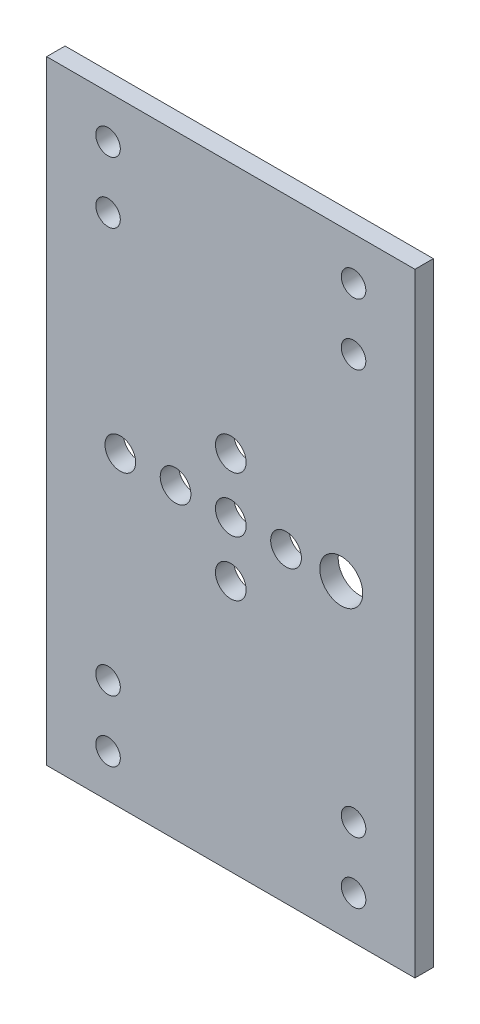
ISO-10303-21;
HEADER;
FILE_DESCRIPTION(('STEP AP214'),'2;1');
FILE_NAME('part.step','',(''),(''),'','','');
FILE_SCHEMA(('AUTOMOTIVE_DESIGN { 1 0 10303 214 1 1 1 1 }'));
ENDSEC;
DATA;
#1=APPLICATION_CONTEXT('core data for automotive mechanical design processes');
#2=APPLICATION_PROTOCOL_DEFINITION('international standard','automotive_design',2000,#1);
#3=PRODUCT_CONTEXT('',#1,'mechanical');
#4=PRODUCT('Part','Part','',(#3));
#5=PRODUCT_RELATED_PRODUCT_CATEGORY('part','',(#4));
#6=PRODUCT_DEFINITION_FORMATION('','',#4);
#7=PRODUCT_DEFINITION_CONTEXT('part definition',#1,'design');
#8=PRODUCT_DEFINITION('design','',#6,#7);
#9=PRODUCT_DEFINITION_SHAPE('','',#8);
#10=(LENGTH_UNIT() NAMED_UNIT(*) SI_UNIT(.MILLI.,.METRE.));
#11=(NAMED_UNIT(*) PLANE_ANGLE_UNIT() SI_UNIT($,.RADIAN.));
#12=(NAMED_UNIT(*) SI_UNIT($,.STERADIAN.) SOLID_ANGLE_UNIT());
#13=UNCERTAINTY_MEASURE_WITH_UNIT(LENGTH_MEASURE(1.E-05),#10,'distance_accuracy_value','');
#14=(GEOMETRIC_REPRESENTATION_CONTEXT(3) GLOBAL_UNCERTAINTY_ASSIGNED_CONTEXT((#13)) GLOBAL_UNIT_ASSIGNED_CONTEXT((#10,
#11,#12)) REPRESENTATION_CONTEXT('',''));
#15=CARTESIAN_POINT('',(0.,0.,0.));
#16=DIRECTION('',(0.,0.,1.));
#17=DIRECTION('',(1.,0.,0.));
#18=AXIS2_PLACEMENT_3D('',#15,#16,#17);
#19=CARTESIAN_POINT('',(0.,0.,3.));
#20=DIRECTION('',(0.,0.,1.));
#21=DIRECTION('',(1.,0.,0.));
#22=AXIS2_PLACEMENT_3D('',#19,#20,#21);
#23=PLANE('',#22);
#24=CARTESIAN_POINT('',(-48.,50.,3.));
#25=DIRECTION('',(0.,0.,1.));
#26=DIRECTION('',(1.,0.,0.));
#27=AXIS2_PLACEMENT_3D('',#24,#25,#26);
#28=CIRCLE('',#27,2.5);
#29=CARTESIAN_POINT('',(-45.5,50.,3.));
#30=VERTEX_POINT('',#29);
#31=EDGE_CURVE('E236',#30,#30,#28,.T.);
#32=ORIENTED_EDGE('',*,*,#31,.F.);
#33=EDGE_LOOP('',(#32));
#34=FACE_BOUND('',#33,.T.);
#35=CARTESIAN_POINT('',(-50.,7.0000000000001,3.));
#36=DIRECTION('',(0.,0.,1.));
#37=DIRECTION('',(-1.,0.,0.));
#38=AXIS2_PLACEMENT_3D('',#35,#36,#37);
#39=CIRCLE('',#38,2.);
#40=CARTESIAN_POINT('',(-52.,7.0000000000001,3.));
#41=VERTEX_POINT('',#40);
#42=EDGE_CURVE('E220',#41,#41,#39,.T.);
#43=ORIENTED_EDGE('',*,*,#42,.F.);
#44=EDGE_LOOP('',(#43));
#45=FACE_BOUND('',#44,.T.);
#46=CARTESIAN_POINT('',(-9.99999999999999,17.0000000000001,3.));
#47=DIRECTION('',(0.,0.,1.));
#48=DIRECTION('',(1.,0.,0.));
#49=AXIS2_PLACEMENT_3D('',#46,#47,#48);
#50=CIRCLE('',#49,2.);
#51=CARTESIAN_POINT('',(-7.99999999999998,17.0000000000001,3.));
#52=VERTEX_POINT('',#51);
#53=EDGE_CURVE('E204',#52,#52,#50,.T.);
#54=ORIENTED_EDGE('',*,*,#53,.F.);
#55=EDGE_LOOP('',(#54));
#56=FACE_BOUND('',#55,.T.);
#57=CARTESIAN_POINT('',(-10.,82.9999999999999,3.));
#58=DIRECTION('',(0.,0.,1.));
#59=DIRECTION('',(-1.,0.,0.));
#60=AXIS2_PLACEMENT_3D('',#57,#58,#59);
#61=CIRCLE('',#60,2.);
#62=CARTESIAN_POINT('',(-12.,82.9999999999999,3.));
#63=VERTEX_POINT('',#62);
#64=EDGE_CURVE('E188',#63,#63,#61,.T.);
#65=ORIENTED_EDGE('',*,*,#64,.F.);
#66=EDGE_LOOP('',(#65));
#67=FACE_BOUND('',#66,.T.);
#68=CARTESIAN_POINT('',(-50.,93.,3.));
#69=DIRECTION('',(0.,0.,1.));
#70=DIRECTION('',(1.,0.,0.));
#71=AXIS2_PLACEMENT_3D('',#68,#69,#70);
#72=CIRCLE('',#71,2.);
#73=CARTESIAN_POINT('',(-48.,93.,3.));
#74=VERTEX_POINT('',#73);
#75=EDGE_CURVE('E172',#74,#74,#72,.T.);
#76=ORIENTED_EDGE('',*,*,#75,.F.);
#77=EDGE_LOOP('',(#76));
#78=FACE_BOUND('',#77,.T.);
#79=CARTESIAN_POINT('',(-39.,50.,3.));
#80=DIRECTION('',(0.,0.,1.));
#81=DIRECTION('',(-1.,0.,0.));
#82=AXIS2_PLACEMENT_3D('',#79,#80,#81);
#83=CIRCLE('',#82,2.5);
#84=CARTESIAN_POINT('',(-41.5,50.,3.));
#85=VERTEX_POINT('',#84);
#86=EDGE_CURVE('E156',#85,#85,#83,.T.);
#87=ORIENTED_EDGE('',*,*,#86,.F.);
#88=EDGE_LOOP('',(#87));
#89=FACE_BOUND('',#88,.T.);
#90=CARTESIAN_POINT('',(-21.,50.,3.));
#91=DIRECTION('',(0.,0.,1.));
#92=DIRECTION('',(1.,0.,0.));
#93=AXIS2_PLACEMENT_3D('',#90,#91,#92);
#94=CIRCLE('',#93,2.5);
#95=CARTESIAN_POINT('',(-18.5,50.,3.));
#96=VERTEX_POINT('',#95);
#97=EDGE_CURVE('E140',#96,#96,#94,.T.);
#98=ORIENTED_EDGE('',*,*,#97,.F.);
#99=EDGE_LOOP('',(#98));
#100=FACE_BOUND('',#99,.T.);
#101=DIRECTION('',(0.,1.,0.));
#102=VECTOR('',#101,1.);
#103=CARTESIAN_POINT('',(0.,0.,3.));
#104=LINE('',#103,#102);
#105=CARTESIAN_POINT('',(0.,0.,3.));
#106=VERTEX_POINT('',#105);
#107=CARTESIAN_POINT('',(0.,100.,3.));
#108=VERTEX_POINT('',#107);
#109=EDGE_CURVE('E98',#106,#108,#104,.T.);
#110=ORIENTED_EDGE('',*,*,#109,.T.);
#111=DIRECTION('',(-1.,0.,0.));
#112=VECTOR('',#111,1.);
#113=CARTESIAN_POINT('',(0.,100.,3.));
#114=LINE('',#113,#112);
#115=CARTESIAN_POINT('',(-60.,100.,3.));
#116=VERTEX_POINT('',#115);
#117=EDGE_CURVE('E93',#108,#116,#114,.T.);
#118=ORIENTED_EDGE('',*,*,#117,.T.);
#119=DIRECTION('',(0.,-1.,0.));
#120=VECTOR('',#119,1.);
#121=CARTESIAN_POINT('',(-60.,0.,3.));
#122=LINE('',#121,#120);
#123=CARTESIAN_POINT('',(-60.,0.,3.));
#124=VERTEX_POINT('',#123);
#125=EDGE_CURVE('E96',#116,#124,#122,.T.);
#126=ORIENTED_EDGE('',*,*,#125,.T.);
#127=DIRECTION('',(1.,0.,0.));
#128=VECTOR('',#127,1.);
#129=CARTESIAN_POINT('',(0.,0.,3.));
#130=LINE('',#129,#128);
#131=EDGE_CURVE('E63',#124,#106,#130,.T.);
#132=ORIENTED_EDGE('',*,*,#131,.T.);
#133=EDGE_LOOP('',(#110,#118,#126,#132));
#134=FACE_BOUND('',#133,.T.);
#135=CARTESIAN_POINT('',(-30.,50.,3.));
#136=DIRECTION('',(0.,0.,1.));
#137=DIRECTION('',(1.,0.,0.));
#138=AXIS2_PLACEMENT_3D('',#135,#136,#137);
#139=CIRCLE('',#138,2.5);
#140=CARTESIAN_POINT('',(-27.5,50.,3.));
#141=VERTEX_POINT('',#140);
#142=EDGE_CURVE('E118',#141,#141,#139,.T.);
#143=ORIENTED_EDGE('',*,*,#142,.F.);
#144=EDGE_LOOP('',(#143));
#145=FACE_BOUND('',#144,.T.);
#146=CARTESIAN_POINT('',(-30.,59.,3.));
#147=DIRECTION('',(0.,0.,1.));
#148=DIRECTION('',(-1.,0.,0.));
#149=AXIS2_PLACEMENT_3D('',#146,#147,#148);
#150=CIRCLE('',#149,2.5);
#151=CARTESIAN_POINT('',(-32.5,59.,3.));
#152=VERTEX_POINT('',#151);
#153=EDGE_CURVE('E148',#152,#152,#150,.T.);
#154=ORIENTED_EDGE('',*,*,#153,.F.);
#155=EDGE_LOOP('',(#154));
#156=FACE_BOUND('',#155,.T.);
#157=CARTESIAN_POINT('',(-30.,41.,3.));
#158=DIRECTION('',(0.,0.,1.));
#159=DIRECTION('',(1.,0.,0.));
#160=AXIS2_PLACEMENT_3D('',#157,#158,#159);
#161=CIRCLE('',#160,2.5);
#162=CARTESIAN_POINT('',(-27.5,41.,3.));
#163=VERTEX_POINT('',#162);
#164=EDGE_CURVE('E164',#163,#163,#161,.T.);
#165=ORIENTED_EDGE('',*,*,#164,.F.);
#166=EDGE_LOOP('',(#165));
#167=FACE_BOUND('',#166,.T.);
#168=CARTESIAN_POINT('',(-50.,83.,3.));
#169=DIRECTION('',(0.,0.,1.));
#170=DIRECTION('',(1.,0.,0.));
#171=AXIS2_PLACEMENT_3D('',#168,#169,#170);
#172=CIRCLE('',#171,2.);
#173=CARTESIAN_POINT('',(-48.,83.,3.));
#174=VERTEX_POINT('',#173);
#175=EDGE_CURVE('E180',#174,#174,#172,.T.);
#176=ORIENTED_EDGE('',*,*,#175,.F.);
#177=EDGE_LOOP('',(#176));
#178=FACE_BOUND('',#177,.T.);
#179=CARTESIAN_POINT('',(-10.,92.9999999999999,3.));
#180=DIRECTION('',(0.,0.,1.));
#181=DIRECTION('',(-1.,0.,0.));
#182=AXIS2_PLACEMENT_3D('',#179,#180,#181);
#183=CIRCLE('',#182,2.);
#184=CARTESIAN_POINT('',(-12.,92.9999999999999,3.));
#185=VERTEX_POINT('',#184);
#186=EDGE_CURVE('E196',#185,#185,#183,.T.);
#187=ORIENTED_EDGE('',*,*,#186,.F.);
#188=EDGE_LOOP('',(#187));
#189=FACE_BOUND('',#188,.T.);
#190=CARTESIAN_POINT('',(-9.99999999999999,7.00000000000006,3.));
#191=DIRECTION('',(0.,0.,1.));
#192=DIRECTION('',(1.,0.,0.));
#193=AXIS2_PLACEMENT_3D('',#190,#191,#192);
#194=CIRCLE('',#193,2.);
#195=CARTESIAN_POINT('',(-7.99999999999998,7.00000000000006,3.));
#196=VERTEX_POINT('',#195);
#197=EDGE_CURVE('E212',#196,#196,#194,.T.);
#198=ORIENTED_EDGE('',*,*,#197,.F.);
#199=EDGE_LOOP('',(#198));
#200=FACE_BOUND('',#199,.T.);
#201=CARTESIAN_POINT('',(-50.,17.0000000000001,3.));
#202=DIRECTION('',(0.,0.,1.));
#203=DIRECTION('',(-1.,0.,0.));
#204=AXIS2_PLACEMENT_3D('',#201,#202,#203);
#205=CIRCLE('',#204,2.);
#206=CARTESIAN_POINT('',(-52.,17.0000000000001,3.));
#207=VERTEX_POINT('',#206);
#208=EDGE_CURVE('E228',#207,#207,#205,.T.);
#209=ORIENTED_EDGE('',*,*,#208,.F.);
#210=EDGE_LOOP('',(#209));
#211=FACE_BOUND('',#210,.T.);
#212=CARTESIAN_POINT('',(-12.,50.,3.));
#213=DIRECTION('',(0.,0.,1.));
#214=DIRECTION('',(1.,0.,0.));
#215=AXIS2_PLACEMENT_3D('',#212,#213,#214);
#216=CIRCLE('',#215,3.5);
#217=CARTESIAN_POINT('',(-8.5,50.,3.));
#218=VERTEX_POINT('',#217);
#219=EDGE_CURVE('E244',#218,#218,#216,.T.);
#220=ORIENTED_EDGE('',*,*,#219,.F.);
#221=EDGE_LOOP('',(#220));
#222=FACE_BOUND('',#221,.T.);
#223=ADVANCED_FACE('F45',(#34,#45,#56,#67,#78,#89,#100,#134,#145,#156,#167,#178,#189,#200,#211,
#222),#23,.T.);
#224=CARTESIAN_POINT('',(0.,0.,0.));
#225=DIRECTION('',(0.,0.,1.));
#226=DIRECTION('',(1.,0.,0.));
#227=AXIS2_PLACEMENT_3D('',#224,#225,#226);
#228=PLANE('',#227);
#229=DIRECTION('',(0.,1.,0.));
#230=VECTOR('',#229,1.);
#231=CARTESIAN_POINT('',(0.,0.,0.));
#232=LINE('',#231,#230);
#233=CARTESIAN_POINT('',(0.,0.,0.));
#234=VERTEX_POINT('',#233);
#235=CARTESIAN_POINT('',(0.,100.,0.));
#236=VERTEX_POINT('',#235);
#237=EDGE_CURVE('E114',#234,#236,#232,.T.);
#238=ORIENTED_EDGE('',*,*,#237,.F.);
#239=DIRECTION('',(1.,0.,0.));
#240=VECTOR('',#239,1.);
#241=CARTESIAN_POINT('',(0.,0.,0.));
#242=LINE('',#241,#240);
#243=CARTESIAN_POINT('',(-60.,0.,0.));
#244=VERTEX_POINT('',#243);
#245=EDGE_CURVE('E86',#244,#234,#242,.T.);
#246=ORIENTED_EDGE('',*,*,#245,.F.);
#247=DIRECTION('',(0.,-1.,0.));
#248=VECTOR('',#247,1.);
#249=CARTESIAN_POINT('',(-60.,0.,0.));
#250=LINE('',#249,#248);
#251=CARTESIAN_POINT('',(-60.,100.,0.));
#252=VERTEX_POINT('',#251);
#253=EDGE_CURVE('E80',#252,#244,#250,.T.);
#254=ORIENTED_EDGE('',*,*,#253,.F.);
#255=DIRECTION('',(-1.,0.,0.));
#256=VECTOR('',#255,1.);
#257=CARTESIAN_POINT('',(0.,100.,0.));
#258=LINE('',#257,#256);
#259=EDGE_CURVE('E103',#236,#252,#258,.T.);
#260=ORIENTED_EDGE('',*,*,#259,.F.);
#261=EDGE_LOOP('',(#238,#246,#254,#260));
#262=FACE_BOUND('',#261,.T.);
#263=CARTESIAN_POINT('',(-30.,50.,0.));
#264=DIRECTION('',(0.,0.,1.));
#265=DIRECTION('',(1.,0.,0.));
#266=AXIS2_PLACEMENT_3D('',#263,#264,#265);
#267=CIRCLE('',#266,2.5);
#268=CARTESIAN_POINT('',(-27.5,50.,0.));
#269=VERTEX_POINT('',#268);
#270=EDGE_CURVE('E136',#269,#269,#267,.T.);
#271=ORIENTED_EDGE('',*,*,#270,.T.);
#272=EDGE_LOOP('',(#271));
#273=FACE_BOUND('',#272,.T.);
#274=CARTESIAN_POINT('',(-21.,50.,0.));
#275=DIRECTION('',(0.,0.,1.));
#276=DIRECTION('',(1.,0.,0.));
#277=AXIS2_PLACEMENT_3D('',#274,#275,#276);
#278=CIRCLE('',#277,2.5);
#279=CARTESIAN_POINT('',(-18.5,50.,0.));
#280=VERTEX_POINT('',#279);
#281=EDGE_CURVE('E144',#280,#280,#278,.T.);
#282=ORIENTED_EDGE('',*,*,#281,.T.);
#283=EDGE_LOOP('',(#282));
#284=FACE_BOUND('',#283,.T.);
#285=CARTESIAN_POINT('',(-30.,59.,0.));
#286=DIRECTION('',(0.,0.,1.));
#287=DIRECTION('',(-1.,0.,0.));
#288=AXIS2_PLACEMENT_3D('',#285,#286,#287);
#289=CIRCLE('',#288,2.5);
#290=CARTESIAN_POINT('',(-32.5,59.,0.));
#291=VERTEX_POINT('',#290);
#292=EDGE_CURVE('E152',#291,#291,#289,.T.);
#293=ORIENTED_EDGE('',*,*,#292,.T.);
#294=EDGE_LOOP('',(#293));
#295=FACE_BOUND('',#294,.T.);
#296=CARTESIAN_POINT('',(-39.,50.,0.));
#297=DIRECTION('',(0.,0.,1.));
#298=DIRECTION('',(-1.,0.,0.));
#299=AXIS2_PLACEMENT_3D('',#296,#297,#298);
#300=CIRCLE('',#299,2.5);
#301=CARTESIAN_POINT('',(-41.5,50.,0.));
#302=VERTEX_POINT('',#301);
#303=EDGE_CURVE('E160',#302,#302,#300,.T.);
#304=ORIENTED_EDGE('',*,*,#303,.T.);
#305=EDGE_LOOP('',(#304));
#306=FACE_BOUND('',#305,.T.);
#307=CARTESIAN_POINT('',(-30.,41.,0.));
#308=DIRECTION('',(0.,0.,1.));
#309=DIRECTION('',(1.,0.,0.));
#310=AXIS2_PLACEMENT_3D('',#307,#308,#309);
#311=CIRCLE('',#310,2.5);
#312=CARTESIAN_POINT('',(-27.5,41.,0.));
#313=VERTEX_POINT('',#312);
#314=EDGE_CURVE('E168',#313,#313,#311,.T.);
#315=ORIENTED_EDGE('',*,*,#314,.T.);
#316=EDGE_LOOP('',(#315));
#317=FACE_BOUND('',#316,.T.);
#318=CARTESIAN_POINT('',(-50.,93.,0.));
#319=DIRECTION('',(0.,0.,1.));
#320=DIRECTION('',(1.,0.,0.));
#321=AXIS2_PLACEMENT_3D('',#318,#319,#320);
#322=CIRCLE('',#321,2.);
#323=CARTESIAN_POINT('',(-48.,93.,0.));
#324=VERTEX_POINT('',#323);
#325=EDGE_CURVE('E176',#324,#324,#322,.T.);
#326=ORIENTED_EDGE('',*,*,#325,.T.);
#327=EDGE_LOOP('',(#326));
#328=FACE_BOUND('',#327,.T.);
#329=CARTESIAN_POINT('',(-50.,83.,0.));
#330=DIRECTION('',(0.,0.,1.));
#331=DIRECTION('',(1.,0.,0.));
#332=AXIS2_PLACEMENT_3D('',#329,#330,#331);
#333=CIRCLE('',#332,2.);
#334=CARTESIAN_POINT('',(-48.,83.,0.));
#335=VERTEX_POINT('',#334);
#336=EDGE_CURVE('E184',#335,#335,#333,.T.);
#337=ORIENTED_EDGE('',*,*,#336,.T.);
#338=EDGE_LOOP('',(#337));
#339=FACE_BOUND('',#338,.T.);
#340=CARTESIAN_POINT('',(-10.,82.9999999999999,0.));
#341=DIRECTION('',(0.,0.,1.));
#342=DIRECTION('',(-1.,0.,0.));
#343=AXIS2_PLACEMENT_3D('',#340,#341,#342);
#344=CIRCLE('',#343,2.);
#345=CARTESIAN_POINT('',(-12.,82.9999999999999,0.));
#346=VERTEX_POINT('',#345);
#347=EDGE_CURVE('E192',#346,#346,#344,.T.);
#348=ORIENTED_EDGE('',*,*,#347,.T.);
#349=EDGE_LOOP('',(#348));
#350=FACE_BOUND('',#349,.T.);
#351=CARTESIAN_POINT('',(-10.,92.9999999999999,0.));
#352=DIRECTION('',(0.,0.,1.));
#353=DIRECTION('',(-1.,0.,0.));
#354=AXIS2_PLACEMENT_3D('',#351,#352,#353);
#355=CIRCLE('',#354,2.);
#356=CARTESIAN_POINT('',(-12.,92.9999999999999,0.));
#357=VERTEX_POINT('',#356);
#358=EDGE_CURVE('E200',#357,#357,#355,.T.);
#359=ORIENTED_EDGE('',*,*,#358,.T.);
#360=EDGE_LOOP('',(#359));
#361=FACE_BOUND('',#360,.T.);
#362=CARTESIAN_POINT('',(-9.99999999999999,17.0000000000001,0.));
#363=DIRECTION('',(0.,0.,1.));
#364=DIRECTION('',(1.,0.,0.));
#365=AXIS2_PLACEMENT_3D('',#362,#363,#364);
#366=CIRCLE('',#365,2.);
#367=CARTESIAN_POINT('',(-7.99999999999998,17.0000000000001,0.));
#368=VERTEX_POINT('',#367);
#369=EDGE_CURVE('E208',#368,#368,#366,.T.);
#370=ORIENTED_EDGE('',*,*,#369,.T.);
#371=EDGE_LOOP('',(#370));
#372=FACE_BOUND('',#371,.T.);
#373=CARTESIAN_POINT('',(-9.99999999999999,7.00000000000006,0.));
#374=DIRECTION('',(0.,0.,1.));
#375=DIRECTION('',(1.,0.,0.));
#376=AXIS2_PLACEMENT_3D('',#373,#374,#375);
#377=CIRCLE('',#376,2.);
#378=CARTESIAN_POINT('',(-7.99999999999998,7.00000000000006,0.));
#379=VERTEX_POINT('',#378);
#380=EDGE_CURVE('E216',#379,#379,#377,.T.);
#381=ORIENTED_EDGE('',*,*,#380,.T.);
#382=EDGE_LOOP('',(#381));
#383=FACE_BOUND('',#382,.T.);
#384=CARTESIAN_POINT('',(-50.,7.0000000000001,0.));
#385=DIRECTION('',(0.,0.,1.));
#386=DIRECTION('',(-1.,0.,0.));
#387=AXIS2_PLACEMENT_3D('',#384,#385,#386);
#388=CIRCLE('',#387,2.);
#389=CARTESIAN_POINT('',(-52.,7.0000000000001,0.));
#390=VERTEX_POINT('',#389);
#391=EDGE_CURVE('E224',#390,#390,#388,.T.);
#392=ORIENTED_EDGE('',*,*,#391,.T.);
#393=EDGE_LOOP('',(#392));
#394=FACE_BOUND('',#393,.T.);
#395=CARTESIAN_POINT('',(-50.,17.0000000000001,0.));
#396=DIRECTION('',(0.,0.,1.));
#397=DIRECTION('',(-1.,0.,0.));
#398=AXIS2_PLACEMENT_3D('',#395,#396,#397);
#399=CIRCLE('',#398,2.);
#400=CARTESIAN_POINT('',(-52.,17.0000000000001,0.));
#401=VERTEX_POINT('',#400);
#402=EDGE_CURVE('E232',#401,#401,#399,.T.);
#403=ORIENTED_EDGE('',*,*,#402,.T.);
#404=EDGE_LOOP('',(#403));
#405=FACE_BOUND('',#404,.T.);
#406=CARTESIAN_POINT('',(-48.,50.,0.));
#407=DIRECTION('',(0.,0.,1.));
#408=DIRECTION('',(1.,0.,0.));
#409=AXIS2_PLACEMENT_3D('',#406,#407,#408);
#410=CIRCLE('',#409,2.5);
#411=CARTESIAN_POINT('',(-45.5,50.,0.));
#412=VERTEX_POINT('',#411);
#413=EDGE_CURVE('E240',#412,#412,#410,.T.);
#414=ORIENTED_EDGE('',*,*,#413,.T.);
#415=EDGE_LOOP('',(#414));
#416=FACE_BOUND('',#415,.T.);
#417=CARTESIAN_POINT('',(-12.,50.,0.));
#418=DIRECTION('',(0.,0.,1.));
#419=DIRECTION('',(1.,0.,0.));
#420=AXIS2_PLACEMENT_3D('',#417,#418,#419);
#421=CIRCLE('',#420,3.5);
#422=CARTESIAN_POINT('',(-8.5,50.,0.));
#423=VERTEX_POINT('',#422);
#424=EDGE_CURVE('E248',#423,#423,#421,.T.);
#425=ORIENTED_EDGE('',*,*,#424,.T.);
#426=EDGE_LOOP('',(#425));
#427=FACE_BOUND('',#426,.T.);
#428=ADVANCED_FACE('F131',(#262,#273,#284,#295,#306,#317,#328,#339,#350,#361,#372,#383,#394,
#405,#416,#427),#228,.F.);
#429=CARTESIAN_POINT('',(0.,0.,3.));
#430=DIRECTION('',(-1.,0.,0.));
#431=DIRECTION('',(0.,-1.,0.));
#432=AXIS2_PLACEMENT_3D('',#429,#430,#431);
#433=PLANE('',#432);
#434=ORIENTED_EDGE('',*,*,#237,.T.);
#435=DIRECTION('',(0.,0.,-1.));
#436=VECTOR('',#435,1.);
#437=CARTESIAN_POINT('',(0.,100.,3.));
#438=LINE('',#437,#436);
#439=EDGE_CURVE('E11',#108,#236,#438,.T.);
#440=ORIENTED_EDGE('',*,*,#439,.F.);
#441=ORIENTED_EDGE('',*,*,#109,.F.);
#442=DIRECTION('',(0.,0.,-1.));
#443=VECTOR('',#442,1.);
#444=CARTESIAN_POINT('',(0.,0.,3.));
#445=LINE('',#444,#443);
#446=EDGE_CURVE('E110',#106,#234,#445,.T.);
#447=ORIENTED_EDGE('',*,*,#446,.T.);
#448=EDGE_LOOP('',(#434,#440,#441,#447));
#449=FACE_BOUND('',#448,.T.);
#450=ADVANCED_FACE('F47',(#449),#433,.F.);
#451=CARTESIAN_POINT('',(0.,100.,3.));
#452=DIRECTION('',(0.,-1.,0.));
#453=DIRECTION('',(1.,0.,0.));
#454=AXIS2_PLACEMENT_3D('',#451,#452,#453);
#455=PLANE('',#454);
#456=ORIENTED_EDGE('',*,*,#259,.T.);
#457=DIRECTION('',(0.,0.,-1.));
#458=VECTOR('',#457,1.);
#459=CARTESIAN_POINT('',(-60.,100.,3.));
#460=LINE('',#459,#458);
#461=EDGE_CURVE('E55',#116,#252,#460,.T.);
#462=ORIENTED_EDGE('',*,*,#461,.F.);
#463=ORIENTED_EDGE('',*,*,#117,.F.);
#464=ORIENTED_EDGE('',*,*,#439,.T.);
#465=EDGE_LOOP('',(#456,#462,#463,#464));
#466=FACE_BOUND('',#465,.T.);
#467=ADVANCED_FACE('F102',(#466),#455,.F.);
#468=CARTESIAN_POINT('',(-60.,0.,3.));
#469=DIRECTION('',(1.,0.,0.));
#470=DIRECTION('',(0.,0.,-1.));
#471=AXIS2_PLACEMENT_3D('',#468,#469,#470);
#472=PLANE('',#471);
#473=ORIENTED_EDGE('',*,*,#253,.T.);
#474=DIRECTION('',(0.,0.,-1.));
#475=VECTOR('',#474,1.);
#476=CARTESIAN_POINT('',(-60.,0.,3.));
#477=LINE('',#476,#475);
#478=EDGE_CURVE('E105',#124,#244,#477,.T.);
#479=ORIENTED_EDGE('',*,*,#478,.F.);
#480=ORIENTED_EDGE('',*,*,#125,.F.);
#481=ORIENTED_EDGE('',*,*,#461,.T.);
#482=EDGE_LOOP('',(#473,#479,#480,#481));
#483=FACE_BOUND('',#482,.T.);
#484=ADVANCED_FACE('F106',(#483),#472,.F.);
#485=CARTESIAN_POINT('',(0.,0.,3.));
#486=DIRECTION('',(0.,1.,0.));
#487=DIRECTION('',(-1.,0.,0.));
#488=AXIS2_PLACEMENT_3D('',#485,#486,#487);
#489=PLANE('',#488);
#490=ORIENTED_EDGE('',*,*,#245,.T.);
#491=ORIENTED_EDGE('',*,*,#446,.F.);
#492=ORIENTED_EDGE('',*,*,#131,.F.);
#493=ORIENTED_EDGE('',*,*,#478,.T.);
#494=EDGE_LOOP('',(#490,#491,#492,#493));
#495=FACE_BOUND('',#494,.T.);
#496=ADVANCED_FACE('F128',(#495),#489,.F.);
#497=CARTESIAN_POINT('',(-30.,50.,3.));
#498=DIRECTION('',(0.,0.,-1.));
#499=DIRECTION('',(-1.,0.,0.));
#500=AXIS2_PLACEMENT_3D('',#497,#498,#499);
#501=CYLINDRICAL_SURFACE('',#500,2.5);
#502=ORIENTED_EDGE('',*,*,#142,.T.);
#503=EDGE_LOOP('',(#502));
#504=FACE_BOUND('',#503,.T.);
#505=ORIENTED_EDGE('',*,*,#270,.F.);
#506=EDGE_LOOP('',(#505));
#507=FACE_BOUND('',#506,.T.);
#508=ADVANCED_FACE('F269',(#504,#507),#501,.F.);
#509=CARTESIAN_POINT('',(-21.,50.,3.));
#510=DIRECTION('',(0.,0.,-1.));
#511=DIRECTION('',(-1.,0.,0.));
#512=AXIS2_PLACEMENT_3D('',#509,#510,#511);
#513=CYLINDRICAL_SURFACE('',#512,2.5);
#514=ORIENTED_EDGE('',*,*,#97,.T.);
#515=EDGE_LOOP('',(#514));
#516=FACE_BOUND('',#515,.T.);
#517=ORIENTED_EDGE('',*,*,#281,.F.);
#518=EDGE_LOOP('',(#517));
#519=FACE_BOUND('',#518,.T.);
#520=ADVANCED_FACE('F314',(#516,#519),#513,.F.);
#521=CARTESIAN_POINT('',(-30.,59.,3.));
#522=DIRECTION('',(0.,0.,-1.));
#523=DIRECTION('',(-1.,0.,0.));
#524=AXIS2_PLACEMENT_3D('',#521,#522,#523);
#525=CYLINDRICAL_SURFACE('',#524,2.5);
#526=ORIENTED_EDGE('',*,*,#153,.T.);
#527=EDGE_LOOP('',(#526));
#528=FACE_BOUND('',#527,.T.);
#529=ORIENTED_EDGE('',*,*,#292,.F.);
#530=EDGE_LOOP('',(#529));
#531=FACE_BOUND('',#530,.T.);
#532=ADVANCED_FACE('F322',(#528,#531),#525,.F.);
#533=CARTESIAN_POINT('',(-39.,50.,3.));
#534=DIRECTION('',(0.,0.,-1.));
#535=DIRECTION('',(-1.,0.,0.));
#536=AXIS2_PLACEMENT_3D('',#533,#534,#535);
#537=CYLINDRICAL_SURFACE('',#536,2.5);
#538=ORIENTED_EDGE('',*,*,#86,.T.);
#539=EDGE_LOOP('',(#538));
#540=FACE_BOUND('',#539,.T.);
#541=ORIENTED_EDGE('',*,*,#303,.F.);
#542=EDGE_LOOP('',(#541));
#543=FACE_BOUND('',#542,.T.);
#544=ADVANCED_FACE('F330',(#540,#543),#537,.F.);
#545=CARTESIAN_POINT('',(-30.,41.,3.));
#546=DIRECTION('',(0.,0.,-1.));
#547=DIRECTION('',(-1.,0.,0.));
#548=AXIS2_PLACEMENT_3D('',#545,#546,#547);
#549=CYLINDRICAL_SURFACE('',#548,2.5);
#550=ORIENTED_EDGE('',*,*,#164,.T.);
#551=EDGE_LOOP('',(#550));
#552=FACE_BOUND('',#551,.T.);
#553=ORIENTED_EDGE('',*,*,#314,.F.);
#554=EDGE_LOOP('',(#553));
#555=FACE_BOUND('',#554,.T.);
#556=ADVANCED_FACE('F339',(#552,#555),#549,.F.);
#557=CARTESIAN_POINT('',(-50.,93.,3.));
#558=DIRECTION('',(0.,0.,-1.));
#559=DIRECTION('',(-1.,0.,0.));
#560=AXIS2_PLACEMENT_3D('',#557,#558,#559);
#561=CYLINDRICAL_SURFACE('',#560,2.);
#562=ORIENTED_EDGE('',*,*,#75,.T.);
#563=EDGE_LOOP('',(#562));
#564=FACE_BOUND('',#563,.T.);
#565=ORIENTED_EDGE('',*,*,#325,.F.);
#566=EDGE_LOOP('',(#565));
#567=FACE_BOUND('',#566,.T.);
#568=ADVANCED_FACE('F348',(#564,#567),#561,.F.);
#569=CARTESIAN_POINT('',(-50.,83.,3.));
#570=DIRECTION('',(0.,0.,-1.));
#571=DIRECTION('',(-1.,0.,0.));
#572=AXIS2_PLACEMENT_3D('',#569,#570,#571);
#573=CYLINDRICAL_SURFACE('',#572,2.);
#574=ORIENTED_EDGE('',*,*,#175,.T.);
#575=EDGE_LOOP('',(#574));
#576=FACE_BOUND('',#575,.T.);
#577=ORIENTED_EDGE('',*,*,#336,.F.);
#578=EDGE_LOOP('',(#577));
#579=FACE_BOUND('',#578,.T.);
#580=ADVANCED_FACE('F357',(#576,#579),#573,.F.);
#581=CARTESIAN_POINT('',(-10.,82.9999999999999,3.));
#582=DIRECTION('',(0.,0.,-1.));
#583=DIRECTION('',(-1.,0.,0.));
#584=AXIS2_PLACEMENT_3D('',#581,#582,#583);
#585=CYLINDRICAL_SURFACE('',#584,2.);
#586=ORIENTED_EDGE('',*,*,#64,.T.);
#587=EDGE_LOOP('',(#586));
#588=FACE_BOUND('',#587,.T.);
#589=ORIENTED_EDGE('',*,*,#347,.F.);
#590=EDGE_LOOP('',(#589));
#591=FACE_BOUND('',#590,.T.);
#592=ADVANCED_FACE('F366',(#588,#591),#585,.F.);
#593=CARTESIAN_POINT('',(-10.,92.9999999999999,3.));
#594=DIRECTION('',(0.,0.,-1.));
#595=DIRECTION('',(-1.,0.,0.));
#596=AXIS2_PLACEMENT_3D('',#593,#594,#595);
#597=CYLINDRICAL_SURFACE('',#596,2.);
#598=ORIENTED_EDGE('',*,*,#186,.T.);
#599=EDGE_LOOP('',(#598));
#600=FACE_BOUND('',#599,.T.);
#601=ORIENTED_EDGE('',*,*,#358,.F.);
#602=EDGE_LOOP('',(#601));
#603=FACE_BOUND('',#602,.T.);
#604=ADVANCED_FACE('F375',(#600,#603),#597,.F.);
#605=CARTESIAN_POINT('',(-9.99999999999999,17.0000000000001,3.));
#606=DIRECTION('',(0.,0.,-1.));
#607=DIRECTION('',(-1.,0.,0.));
#608=AXIS2_PLACEMENT_3D('',#605,#606,#607);
#609=CYLINDRICAL_SURFACE('',#608,2.);
#610=ORIENTED_EDGE('',*,*,#53,.T.);
#611=EDGE_LOOP('',(#610));
#612=FACE_BOUND('',#611,.T.);
#613=ORIENTED_EDGE('',*,*,#369,.F.);
#614=EDGE_LOOP('',(#613));
#615=FACE_BOUND('',#614,.T.);
#616=ADVANCED_FACE('F384',(#612,#615),#609,.F.);
#617=CARTESIAN_POINT('',(-9.99999999999999,7.00000000000006,3.));
#618=DIRECTION('',(0.,0.,-1.));
#619=DIRECTION('',(-1.,0.,0.));
#620=AXIS2_PLACEMENT_3D('',#617,#618,#619);
#621=CYLINDRICAL_SURFACE('',#620,2.);
#622=ORIENTED_EDGE('',*,*,#197,.T.);
#623=EDGE_LOOP('',(#622));
#624=FACE_BOUND('',#623,.T.);
#625=ORIENTED_EDGE('',*,*,#380,.F.);
#626=EDGE_LOOP('',(#625));
#627=FACE_BOUND('',#626,.T.);
#628=ADVANCED_FACE('F393',(#624,#627),#621,.F.);
#629=CARTESIAN_POINT('',(-50.,7.0000000000001,3.));
#630=DIRECTION('',(0.,0.,-1.));
#631=DIRECTION('',(-1.,0.,0.));
#632=AXIS2_PLACEMENT_3D('',#629,#630,#631);
#633=CYLINDRICAL_SURFACE('',#632,2.);
#634=ORIENTED_EDGE('',*,*,#42,.T.);
#635=EDGE_LOOP('',(#634));
#636=FACE_BOUND('',#635,.T.);
#637=ORIENTED_EDGE('',*,*,#391,.F.);
#638=EDGE_LOOP('',(#637));
#639=FACE_BOUND('',#638,.T.);
#640=ADVANCED_FACE('F402',(#636,#639),#633,.F.);
#641=CARTESIAN_POINT('',(-50.,17.0000000000001,3.));
#642=DIRECTION('',(0.,0.,-1.));
#643=DIRECTION('',(-1.,0.,0.));
#644=AXIS2_PLACEMENT_3D('',#641,#642,#643);
#645=CYLINDRICAL_SURFACE('',#644,2.);
#646=ORIENTED_EDGE('',*,*,#208,.T.);
#647=EDGE_LOOP('',(#646));
#648=FACE_BOUND('',#647,.T.);
#649=ORIENTED_EDGE('',*,*,#402,.F.);
#650=EDGE_LOOP('',(#649));
#651=FACE_BOUND('',#650,.T.);
#652=ADVANCED_FACE('F411',(#648,#651),#645,.F.);
#653=CARTESIAN_POINT('',(-48.,50.,3.));
#654=DIRECTION('',(0.,0.,-1.));
#655=DIRECTION('',(-1.,0.,0.));
#656=AXIS2_PLACEMENT_3D('',#653,#654,#655);
#657=CYLINDRICAL_SURFACE('',#656,2.5);
#658=ORIENTED_EDGE('',*,*,#31,.T.);
#659=EDGE_LOOP('',(#658));
#660=FACE_BOUND('',#659,.T.);
#661=ORIENTED_EDGE('',*,*,#413,.F.);
#662=EDGE_LOOP('',(#661));
#663=FACE_BOUND('',#662,.T.);
#664=ADVANCED_FACE('F420',(#660,#663),#657,.F.);
#665=CARTESIAN_POINT('',(-12.,50.,3.));
#666=DIRECTION('',(0.,0.,-1.));
#667=DIRECTION('',(-1.,0.,0.));
#668=AXIS2_PLACEMENT_3D('',#665,#666,#667);
#669=CYLINDRICAL_SURFACE('',#668,3.5);
#670=ORIENTED_EDGE('',*,*,#219,.T.);
#671=EDGE_LOOP('',(#670));
#672=FACE_BOUND('',#671,.T.);
#673=ORIENTED_EDGE('',*,*,#424,.F.);
#674=EDGE_LOOP('',(#673));
#675=FACE_BOUND('',#674,.T.);
#676=ADVANCED_FACE('F256',(#672,#675),#669,.F.);
#677=CLOSED_SHELL('',(#223,#428,#450,#467,#484,#496,#508,#520,#532,#544,#556,#568,#580,#592,
#604,#616,#628,#640,#652,#664,#676));
#678=MANIFOLD_SOLID_BREP('B2',#677);
#679=ADVANCED_BREP_SHAPE_REPRESENTATION('',(#18,#678),#14);
#680=SHAPE_DEFINITION_REPRESENTATION(#9,#679);
ENDSEC;
END-ISO-10303-21;
